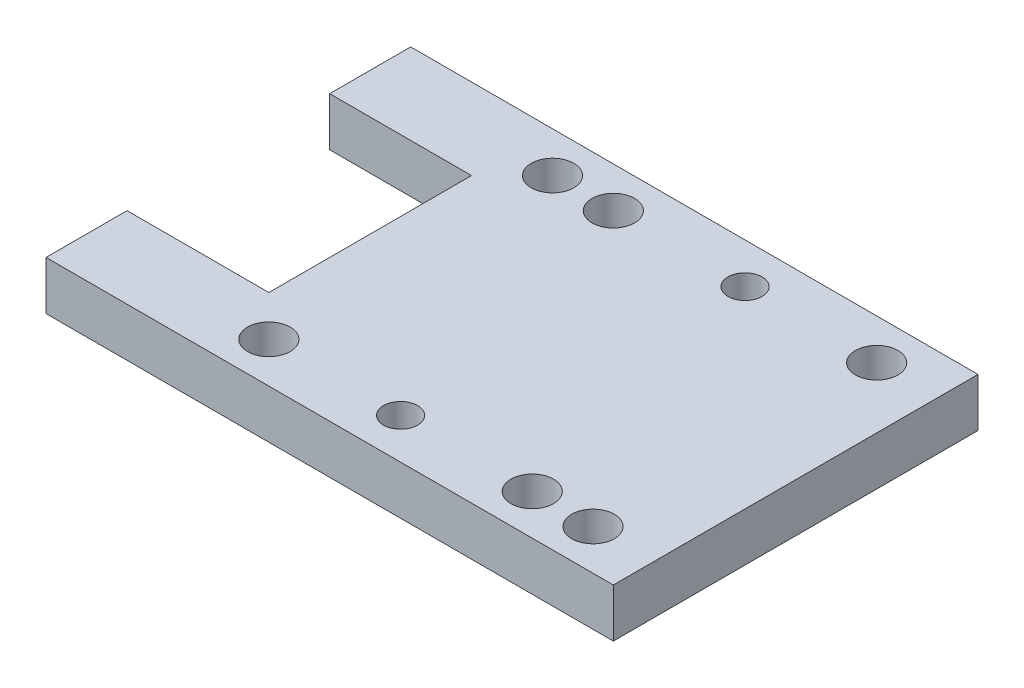
ISO-10303-21;
HEADER;
FILE_DESCRIPTION(('STEP AP214'),'2;1');
FILE_NAME('part.step','',(''),(''),'','','');
FILE_SCHEMA(('AUTOMOTIVE_DESIGN { 1 0 10303 214 1 1 1 1 }'));
ENDSEC;
DATA;
#1=APPLICATION_CONTEXT('core data for automotive mechanical design processes');
#2=APPLICATION_PROTOCOL_DEFINITION('international standard','automotive_design',2000,#1);
#3=PRODUCT_CONTEXT('',#1,'mechanical');
#4=PRODUCT('Part','Part','',(#3));
#5=PRODUCT_RELATED_PRODUCT_CATEGORY('part','',(#4));
#6=PRODUCT_DEFINITION_FORMATION('','',#4);
#7=PRODUCT_DEFINITION_CONTEXT('part definition',#1,'design');
#8=PRODUCT_DEFINITION('design','',#6,#7);
#9=PRODUCT_DEFINITION_SHAPE('','',#8);
#10=(LENGTH_UNIT() NAMED_UNIT(*) SI_UNIT(.MILLI.,.METRE.));
#11=(NAMED_UNIT(*) PLANE_ANGLE_UNIT() SI_UNIT($,.RADIAN.));
#12=(NAMED_UNIT(*) SI_UNIT($,.STERADIAN.) SOLID_ANGLE_UNIT());
#13=UNCERTAINTY_MEASURE_WITH_UNIT(LENGTH_MEASURE(1.E-05),#10,'distance_accuracy_value','');
#14=(GEOMETRIC_REPRESENTATION_CONTEXT(3) GLOBAL_UNCERTAINTY_ASSIGNED_CONTEXT((#13)) GLOBAL_UNIT_ASSIGNED_CONTEXT((#10,
#11,#12)) REPRESENTATION_CONTEXT('',''));
#15=CARTESIAN_POINT('',(0.,0.,0.));
#16=DIRECTION('',(0.,0.,1.));
#17=DIRECTION('',(1.,0.,0.));
#18=AXIS2_PLACEMENT_3D('',#15,#16,#17);
#19=CARTESIAN_POINT('',(-70.,-12.,45.));
#20=DIRECTION('',(-1.,0.,0.));
#21=DIRECTION('',(0.,0.,1.));
#22=AXIS2_PLACEMENT_3D('',#19,#20,#21);
#23=PLANE('',#22);
#24=CARTESIAN_POINT('',(-70.,-6.,-35.));
#25=DIRECTION('',(-1.,0.,0.));
#26=DIRECTION('',(0.,0.,1.));
#27=AXIS2_PLACEMENT_3D('',#24,#25,#26);
#28=CIRCLE('',#27,3.39999999999999);
#29=CARTESIAN_POINT('',(-70.,-6.,-31.6));
#30=VERTEX_POINT('',#29);
#31=EDGE_CURVE('E138',#30,#30,#28,.T.);
#32=ORIENTED_EDGE('',*,*,#31,.F.);
#33=EDGE_LOOP('',(#32));
#34=FACE_BOUND('',#33,.T.);
#35=DIRECTION('',(0.,1.,0.));
#36=VECTOR('',#35,1.);
#37=CARTESIAN_POINT('',(-70.,-12.001,-25.));
#38=LINE('',#37,#36);
#39=CARTESIAN_POINT('',(-70.,-12.,-25.));
#40=VERTEX_POINT('',#39);
#41=CARTESIAN_POINT('',(-70.,0.,-25.));
#42=VERTEX_POINT('',#41);
#43=EDGE_CURVE('E200',#40,#42,#38,.T.);
#44=ORIENTED_EDGE('',*,*,#43,.T.);
#45=DIRECTION('',(0.,0.,1.));
#46=VECTOR('',#45,1.);
#47=CARTESIAN_POINT('',(-70.,0.,45.));
#48=LINE('',#47,#46);
#49=CARTESIAN_POINT('',(-70.,0.,-45.));
#50=VERTEX_POINT('',#49);
#51=EDGE_CURVE('E229',#50,#42,#48,.T.);
#52=ORIENTED_EDGE('',*,*,#51,.F.);
#53=DIRECTION('',(0.,1.,0.));
#54=VECTOR('',#53,1.);
#55=CARTESIAN_POINT('',(-70.,-12.,-45.));
#56=LINE('',#55,#54);
#57=CARTESIAN_POINT('',(-70.,-12.,-45.));
#58=VERTEX_POINT('',#57);
#59=EDGE_CURVE('E235',#58,#50,#56,.T.);
#60=ORIENTED_EDGE('',*,*,#59,.F.);
#61=DIRECTION('',(0.,0.,1.));
#62=VECTOR('',#61,1.);
#63=CARTESIAN_POINT('',(-70.,-12.,45.));
#64=LINE('',#63,#62);
#65=EDGE_CURVE('E218',#58,#40,#64,.T.);
#66=ORIENTED_EDGE('',*,*,#65,.T.);
#67=EDGE_LOOP('',(#44,#52,#60,#66));
#68=FACE_BOUND('',#67,.T.);
#69=ADVANCED_FACE('F50',(#34,#68),#23,.T.);
#70=CARTESIAN_POINT('',(70.,-12.,45.));
#71=DIRECTION('',(1.,0.,0.));
#72=DIRECTION('',(0.,0.,-1.));
#73=AXIS2_PLACEMENT_3D('',#70,#71,#72);
#74=PLANE('',#73);
#75=DIRECTION('',(0.,0.,-1.));
#76=VECTOR('',#75,1.);
#77=CARTESIAN_POINT('',(70.,0.,45.));
#78=LINE('',#77,#76);
#79=CARTESIAN_POINT('',(70.,0.,45.));
#80=VERTEX_POINT('',#79);
#81=CARTESIAN_POINT('',(70.,0.,-45.));
#82=VERTEX_POINT('',#81);
#83=EDGE_CURVE('E211',#80,#82,#78,.T.);
#84=ORIENTED_EDGE('',*,*,#83,.F.);
#85=DIRECTION('',(0.,1.,0.));
#86=VECTOR('',#85,1.);
#87=CARTESIAN_POINT('',(70.,-12.,45.));
#88=LINE('',#87,#86);
#89=CARTESIAN_POINT('',(70.,-12.,45.));
#90=VERTEX_POINT('',#89);
#91=EDGE_CURVE('E11',#90,#80,#88,.T.);
#92=ORIENTED_EDGE('',*,*,#91,.F.);
#93=DIRECTION('',(0.,0.,-1.));
#94=VECTOR('',#93,1.);
#95=CARTESIAN_POINT('',(70.,-12.,45.));
#96=LINE('',#95,#94);
#97=CARTESIAN_POINT('',(70.,-12.,-45.));
#98=VERTEX_POINT('',#97);
#99=EDGE_CURVE('E212',#90,#98,#96,.T.);
#100=ORIENTED_EDGE('',*,*,#99,.T.);
#101=DIRECTION('',(0.,1.,0.));
#102=VECTOR('',#101,1.);
#103=CARTESIAN_POINT('',(70.,-12.,-45.));
#104=LINE('',#103,#102);
#105=EDGE_CURVE('E54',#98,#82,#104,.T.);
#106=ORIENTED_EDGE('',*,*,#105,.T.);
#107=EDGE_LOOP('',(#84,#92,#100,#106));
#108=FACE_BOUND('',#107,.T.);
#109=ADVANCED_FACE('F52',(#108),#74,.T.);
#110=CARTESIAN_POINT('',(-70.,-12.,45.));
#111=DIRECTION('',(0.,0.,1.));
#112=DIRECTION('',(1.,0.,0.));
#113=AXIS2_PLACEMENT_3D('',#110,#111,#112);
#114=PLANE('',#113);
#115=DIRECTION('',(1.,0.,0.));
#116=VECTOR('',#115,1.);
#117=CARTESIAN_POINT('',(-70.,0.,45.));
#118=LINE('',#117,#116);
#119=CARTESIAN_POINT('',(-70.,0.,45.));
#120=VERTEX_POINT('',#119);
#121=EDGE_CURVE('E215',#120,#80,#118,.T.);
#122=ORIENTED_EDGE('',*,*,#121,.F.);
#123=DIRECTION('',(0.,1.,0.));
#124=VECTOR('',#123,1.);
#125=CARTESIAN_POINT('',(-70.,-12.,45.));
#126=LINE('',#125,#124);
#127=CARTESIAN_POINT('',(-70.,-12.,45.));
#128=VERTEX_POINT('',#127);
#129=EDGE_CURVE('E59',#128,#120,#126,.T.);
#130=ORIENTED_EDGE('',*,*,#129,.F.);
#131=DIRECTION('',(1.,0.,0.));
#132=VECTOR('',#131,1.);
#133=CARTESIAN_POINT('',(-70.,-12.,45.));
#134=LINE('',#133,#132);
#135=EDGE_CURVE('E221',#128,#90,#134,.T.);
#136=ORIENTED_EDGE('',*,*,#135,.T.);
#137=ORIENTED_EDGE('',*,*,#91,.T.);
#138=EDGE_LOOP('',(#122,#130,#136,#137));
#139=FACE_BOUND('',#138,.T.);
#140=ADVANCED_FACE('F242',(#139),#114,.T.);
#141=CARTESIAN_POINT('',(-70.,-6.,35.));
#142=DIRECTION('',(-1.,0.,0.));
#143=DIRECTION('',(0.,0.,1.));
#144=AXIS2_PLACEMENT_3D('',#141,#142,#143);
#145=CIRCLE('',#144,3.39999999999999);
#146=CARTESIAN_POINT('',(-70.,-6.,38.4));
#147=VERTEX_POINT('',#146);
#148=EDGE_CURVE('E139',#147,#147,#145,.T.);
#149=ORIENTED_EDGE('',*,*,#148,.F.);
#150=EDGE_LOOP('',(#149));
#151=FACE_BOUND('',#150,.T.);
#152=DIRECTION('',(0.,1.,0.));
#153=VECTOR('',#152,1.);
#154=CARTESIAN_POINT('',(-70.,-12.001,25.));
#155=LINE('',#154,#153);
#156=CARTESIAN_POINT('',(-70.,-12.,25.));
#157=VERTEX_POINT('',#156);
#158=CARTESIAN_POINT('',(-70.,0.,25.));
#159=VERTEX_POINT('',#158);
#160=EDGE_CURVE('E67',#157,#159,#155,.T.);
#161=ORIENTED_EDGE('',*,*,#160,.F.);
#162=EDGE_CURVE('E217',#157,#128,#64,.T.);
#163=ORIENTED_EDGE('',*,*,#162,.T.);
#164=ORIENTED_EDGE('',*,*,#129,.T.);
#165=EDGE_CURVE('E228',#159,#120,#48,.T.);
#166=ORIENTED_EDGE('',*,*,#165,.F.);
#167=EDGE_LOOP('',(#161,#163,#164,#166));
#168=FACE_BOUND('',#167,.T.);
#169=ADVANCED_FACE('F259',(#151,#168),#23,.T.);
#170=CARTESIAN_POINT('',(-70.,-12.,-45.));
#171=DIRECTION('',(0.,0.,-1.));
#172=DIRECTION('',(-1.,0.,0.));
#173=AXIS2_PLACEMENT_3D('',#170,#171,#172);
#174=PLANE('',#173);
#175=DIRECTION('',(-1.,0.,0.));
#176=VECTOR('',#175,1.);
#177=CARTESIAN_POINT('',(-70.,0.,-45.));
#178=LINE('',#177,#176);
#179=EDGE_CURVE('E225',#82,#50,#178,.T.);
#180=ORIENTED_EDGE('',*,*,#179,.F.);
#181=ORIENTED_EDGE('',*,*,#105,.F.);
#182=DIRECTION('',(-1.,0.,0.));
#183=VECTOR('',#182,1.);
#184=CARTESIAN_POINT('',(-70.,-12.,-45.));
#185=LINE('',#184,#183);
#186=EDGE_CURVE('E214',#98,#58,#185,.T.);
#187=ORIENTED_EDGE('',*,*,#186,.T.);
#188=ORIENTED_EDGE('',*,*,#59,.T.);
#189=EDGE_LOOP('',(#180,#181,#187,#188));
#190=FACE_BOUND('',#189,.T.);
#191=ADVANCED_FACE('F237',(#190),#174,.T.);
#192=CARTESIAN_POINT('',(0.,-12.,0.));
#193=DIRECTION('',(0.,-1.,0.));
#194=DIRECTION('',(0.,0.,-1.));
#195=AXIS2_PLACEMENT_3D('',#192,#193,#194);
#196=PLANE('',#195);
#197=CARTESIAN_POINT('',(22.5,-12.,-35.));
#198=DIRECTION('',(0.,1.,0.));
#199=DIRECTION('',(0.,0.,1.));
#200=AXIS2_PLACEMENT_3D('',#197,#198,#199);
#201=CIRCLE('',#200,4.19999999999999);
#202=CARTESIAN_POINT('',(22.5,-12.,-30.8));
#203=VERTEX_POINT('',#202);
#204=EDGE_CURVE('E356',#203,#203,#201,.T.);
#205=ORIENTED_EDGE('',*,*,#204,.T.);
#206=EDGE_LOOP('',(#205));
#207=FACE_BOUND('',#206,.T.);
#208=CARTESIAN_POINT('',(7.50000000000001,-12.,35.));
#209=DIRECTION('',(0.,1.,0.));
#210=DIRECTION('',(0.,0.,1.));
#211=AXIS2_PLACEMENT_3D('',#208,#209,#210);
#212=CIRCLE('',#211,4.19999999999999);
#213=CARTESIAN_POINT('',(7.50000000000001,-12.,39.2));
#214=VERTEX_POINT('',#213);
#215=EDGE_CURVE('E145',#214,#214,#212,.T.);
#216=ORIENTED_EDGE('',*,*,#215,.T.);
#217=EDGE_LOOP('',(#216));
#218=FACE_BOUND('',#217,.T.);
#219=CARTESIAN_POINT('',(-25.,-12.,-35.));
#220=DIRECTION('',(0.,1.,0.));
#221=DIRECTION('',(0.,0.,1.));
#222=AXIS2_PLACEMENT_3D('',#219,#220,#221);
#223=CIRCLE('',#222,5.25);
#224=CARTESIAN_POINT('',(-25.,-12.,-29.75));
#225=VERTEX_POINT('',#224);
#226=EDGE_CURVE('E154',#225,#225,#223,.T.);
#227=ORIENTED_EDGE('',*,*,#226,.T.);
#228=EDGE_LOOP('',(#227));
#229=FACE_BOUND('',#228,.T.);
#230=CARTESIAN_POINT('',(55.,-12.,35.));
#231=DIRECTION('',(0.,1.,0.));
#232=DIRECTION('',(0.,0.,1.));
#233=AXIS2_PLACEMENT_3D('',#230,#231,#232);
#234=CIRCLE('',#233,5.25);
#235=CARTESIAN_POINT('',(55.,-12.,40.25));
#236=VERTEX_POINT('',#235);
#237=EDGE_CURVE('E160',#236,#236,#234,.T.);
#238=ORIENTED_EDGE('',*,*,#237,.T.);
#239=EDGE_LOOP('',(#238));
#240=FACE_BOUND('',#239,.T.);
#241=CARTESIAN_POINT('',(-9.99999999999999,-12.,-35.));
#242=DIRECTION('',(0.,1.,0.));
#243=DIRECTION('',(0.,0.,1.));
#244=AXIS2_PLACEMENT_3D('',#241,#242,#243);
#245=CIRCLE('',#244,5.25);
#246=CARTESIAN_POINT('',(-9.99999999999999,-12.,-29.75));
#247=VERTEX_POINT('',#246);
#248=EDGE_CURVE('E166',#247,#247,#245,.T.);
#249=ORIENTED_EDGE('',*,*,#248,.T.);
#250=EDGE_LOOP('',(#249));
#251=FACE_BOUND('',#250,.T.);
#252=CARTESIAN_POINT('',(55.,-12.,-35.));
#253=DIRECTION('',(0.,1.,0.));
#254=DIRECTION('',(0.,0.,1.));
#255=AXIS2_PLACEMENT_3D('',#252,#253,#254);
#256=CIRCLE('',#255,5.25);
#257=CARTESIAN_POINT('',(55.,-12.,-29.75));
#258=VERTEX_POINT('',#257);
#259=EDGE_CURVE('E172',#258,#258,#256,.T.);
#260=ORIENTED_EDGE('',*,*,#259,.T.);
#261=EDGE_LOOP('',(#260));
#262=FACE_BOUND('',#261,.T.);
#263=CARTESIAN_POINT('',(40.,-12.,35.));
#264=DIRECTION('',(0.,1.,0.));
#265=DIRECTION('',(0.,0.,1.));
#266=AXIS2_PLACEMENT_3D('',#263,#264,#265);
#267=CIRCLE('',#266,5.25);
#268=CARTESIAN_POINT('',(40.,-12.,40.25));
#269=VERTEX_POINT('',#268);
#270=EDGE_CURVE('E178',#269,#269,#267,.T.);
#271=ORIENTED_EDGE('',*,*,#270,.T.);
#272=EDGE_LOOP('',(#271));
#273=FACE_BOUND('',#272,.T.);
#274=CARTESIAN_POINT('',(-25.,-12.,35.));
#275=DIRECTION('',(0.,1.,0.));
#276=DIRECTION('',(0.,0.,1.));
#277=AXIS2_PLACEMENT_3D('',#274,#275,#276);
#278=CIRCLE('',#277,5.24999999999999);
#279=CARTESIAN_POINT('',(-25.,-12.,40.25));
#280=VERTEX_POINT('',#279);
#281=EDGE_CURVE('E184',#280,#280,#278,.T.);
#282=ORIENTED_EDGE('',*,*,#281,.T.);
#283=EDGE_LOOP('',(#282));
#284=FACE_BOUND('',#283,.T.);
#285=DIRECTION('',(-1.,0.,0.));
#286=VECTOR('',#285,1.);
#287=CARTESIAN_POINT('',(-70.,-12.,-25.));
#288=LINE('',#287,#286);
#289=CARTESIAN_POINT('',(-35.,-12.,-25.));
#290=VERTEX_POINT('',#289);
#291=EDGE_CURVE('E190',#290,#40,#288,.T.);
#292=ORIENTED_EDGE('',*,*,#291,.T.);
#293=ORIENTED_EDGE('',*,*,#65,.F.);
#294=ORIENTED_EDGE('',*,*,#186,.F.);
#295=ORIENTED_EDGE('',*,*,#99,.F.);
#296=ORIENTED_EDGE('',*,*,#135,.F.);
#297=ORIENTED_EDGE('',*,*,#162,.F.);
#298=DIRECTION('',(1.,0.,0.));
#299=VECTOR('',#298,1.);
#300=CARTESIAN_POINT('',(-70.,-12.,25.));
#301=LINE('',#300,#299);
#302=CARTESIAN_POINT('',(-35.,-12.,25.));
#303=VERTEX_POINT('',#302);
#304=EDGE_CURVE('E203',#157,#303,#301,.T.);
#305=ORIENTED_EDGE('',*,*,#304,.T.);
#306=DIRECTION('',(0.,0.,-1.));
#307=VECTOR('',#306,1.);
#308=CARTESIAN_POINT('',(-35.,-12.,25.));
#309=LINE('',#308,#307);
#310=EDGE_CURVE('E187',#303,#290,#309,.T.);
#311=ORIENTED_EDGE('',*,*,#310,.T.);
#312=EDGE_LOOP('',(#292,#293,#294,#295,#296,#297,#305,#311));
#313=FACE_BOUND('',#312,.T.);
#314=ADVANCED_FACE('F247',(#207,#218,#229,#240,#251,#262,#273,#284,#313),#196,.T.);
#315=CARTESIAN_POINT('',(0.,0.,0.));
#316=DIRECTION('',(0.,-1.,0.));
#317=DIRECTION('',(0.,0.,-1.));
#318=AXIS2_PLACEMENT_3D('',#315,#316,#317);
#319=PLANE('',#318);
#320=CARTESIAN_POINT('',(22.5,0.,-35.));
#321=DIRECTION('',(0.,1.,0.));
#322=DIRECTION('',(0.,0.,1.));
#323=AXIS2_PLACEMENT_3D('',#320,#321,#322);
#324=CIRCLE('',#323,4.19999999999999);
#325=CARTESIAN_POINT('',(22.5,0.,-30.8));
#326=VERTEX_POINT('',#325);
#327=EDGE_CURVE('E333',#326,#326,#324,.T.);
#328=ORIENTED_EDGE('',*,*,#327,.F.);
#329=EDGE_LOOP('',(#328));
#330=FACE_BOUND('',#329,.T.);
#331=CARTESIAN_POINT('',(7.50000000000001,0.,35.));
#332=DIRECTION('',(0.,1.,0.));
#333=DIRECTION('',(0.,0.,1.));
#334=AXIS2_PLACEMENT_3D('',#331,#332,#333);
#335=CIRCLE('',#334,4.19999999999999);
#336=CARTESIAN_POINT('',(7.50000000000001,0.,39.2));
#337=VERTEX_POINT('',#336);
#338=EDGE_CURVE('E337',#337,#337,#335,.T.);
#339=ORIENTED_EDGE('',*,*,#338,.F.);
#340=EDGE_LOOP('',(#339));
#341=FACE_BOUND('',#340,.T.);
#342=CARTESIAN_POINT('',(-25.,0.,-35.));
#343=DIRECTION('',(0.,1.,0.));
#344=DIRECTION('',(0.,0.,1.));
#345=AXIS2_PLACEMENT_3D('',#342,#343,#344);
#346=CIRCLE('',#345,5.25);
#347=CARTESIAN_POINT('',(-25.,0.,-29.75));
#348=VERTEX_POINT('',#347);
#349=EDGE_CURVE('E151',#348,#348,#346,.T.);
#350=ORIENTED_EDGE('',*,*,#349,.F.);
#351=EDGE_LOOP('',(#350));
#352=FACE_BOUND('',#351,.T.);
#353=CARTESIAN_POINT('',(55.,0.,35.));
#354=DIRECTION('',(0.,1.,0.));
#355=DIRECTION('',(0.,0.,1.));
#356=AXIS2_PLACEMENT_3D('',#353,#354,#355);
#357=CIRCLE('',#356,5.25);
#358=CARTESIAN_POINT('',(55.,0.,40.25));
#359=VERTEX_POINT('',#358);
#360=EDGE_CURVE('E157',#359,#359,#357,.T.);
#361=ORIENTED_EDGE('',*,*,#360,.F.);
#362=EDGE_LOOP('',(#361));
#363=FACE_BOUND('',#362,.T.);
#364=CARTESIAN_POINT('',(-9.99999999999999,0.,-35.));
#365=DIRECTION('',(0.,1.,0.));
#366=DIRECTION('',(0.,0.,1.));
#367=AXIS2_PLACEMENT_3D('',#364,#365,#366);
#368=CIRCLE('',#367,5.24999999999999);
#369=CARTESIAN_POINT('',(-9.99999999999999,0.,-29.75));
#370=VERTEX_POINT('',#369);
#371=EDGE_CURVE('E163',#370,#370,#368,.T.);
#372=ORIENTED_EDGE('',*,*,#371,.F.);
#373=EDGE_LOOP('',(#372));
#374=FACE_BOUND('',#373,.T.);
#375=CARTESIAN_POINT('',(55.,0.,-35.));
#376=DIRECTION('',(0.,1.,0.));
#377=DIRECTION('',(0.,0.,1.));
#378=AXIS2_PLACEMENT_3D('',#375,#376,#377);
#379=CIRCLE('',#378,5.24999999999999);
#380=CARTESIAN_POINT('',(55.,0.,-29.75));
#381=VERTEX_POINT('',#380);
#382=EDGE_CURVE('E169',#381,#381,#379,.T.);
#383=ORIENTED_EDGE('',*,*,#382,.F.);
#384=EDGE_LOOP('',(#383));
#385=FACE_BOUND('',#384,.T.);
#386=CARTESIAN_POINT('',(40.,0.,35.));
#387=DIRECTION('',(0.,1.,0.));
#388=DIRECTION('',(0.,0.,1.));
#389=AXIS2_PLACEMENT_3D('',#386,#387,#388);
#390=CIRCLE('',#389,5.24999999999999);
#391=CARTESIAN_POINT('',(40.,0.,40.25));
#392=VERTEX_POINT('',#391);
#393=EDGE_CURVE('E175',#392,#392,#390,.T.);
#394=ORIENTED_EDGE('',*,*,#393,.F.);
#395=EDGE_LOOP('',(#394));
#396=FACE_BOUND('',#395,.T.);
#397=CARTESIAN_POINT('',(-25.,0.,35.));
#398=DIRECTION('',(0.,1.,0.));
#399=DIRECTION('',(0.,0.,1.));
#400=AXIS2_PLACEMENT_3D('',#397,#398,#399);
#401=CIRCLE('',#400,5.24999999999999);
#402=CARTESIAN_POINT('',(-25.,0.,40.25));
#403=VERTEX_POINT('',#402);
#404=EDGE_CURVE('E181',#403,#403,#401,.T.);
#405=ORIENTED_EDGE('',*,*,#404,.F.);
#406=EDGE_LOOP('',(#405));
#407=FACE_BOUND('',#406,.T.);
#408=ORIENTED_EDGE('',*,*,#51,.T.);
#409=DIRECTION('',(-1.,0.,0.));
#410=VECTOR('',#409,1.);
#411=CARTESIAN_POINT('',(-70.,0.,-25.));
#412=LINE('',#411,#410);
#413=CARTESIAN_POINT('',(-35.,0.,-25.));
#414=VERTEX_POINT('',#413);
#415=EDGE_CURVE('E198',#414,#42,#412,.T.);
#416=ORIENTED_EDGE('',*,*,#415,.F.);
#417=DIRECTION('',(0.,0.,-1.));
#418=VECTOR('',#417,1.);
#419=CARTESIAN_POINT('',(-35.,0.,25.));
#420=LINE('',#419,#418);
#421=CARTESIAN_POINT('',(-35.,0.,25.));
#422=VERTEX_POINT('',#421);
#423=EDGE_CURVE('E195',#422,#414,#420,.T.);
#424=ORIENTED_EDGE('',*,*,#423,.F.);
#425=DIRECTION('',(1.,0.,0.));
#426=VECTOR('',#425,1.);
#427=CARTESIAN_POINT('',(-70.,0.,25.));
#428=LINE('',#427,#426);
#429=EDGE_CURVE('E193',#159,#422,#428,.T.);
#430=ORIENTED_EDGE('',*,*,#429,.F.);
#431=ORIENTED_EDGE('',*,*,#165,.T.);
#432=ORIENTED_EDGE('',*,*,#121,.T.);
#433=ORIENTED_EDGE('',*,*,#83,.T.);
#434=ORIENTED_EDGE('',*,*,#179,.T.);
#435=EDGE_LOOP('',(#408,#416,#424,#430,#431,#432,#433,#434));
#436=FACE_BOUND('',#435,.T.);
#437=ADVANCED_FACE('F239',(#330,#341,#352,#363,#374,#385,#396,#407,#436),#319,.F.);
#438=CARTESIAN_POINT('',(-70.,-12.001,-25.));
#439=DIRECTION('',(0.,0.,-1.));
#440=DIRECTION('',(-1.,0.,0.));
#441=AXIS2_PLACEMENT_3D('',#438,#439,#440);
#442=PLANE('',#441);
#443=DIRECTION('',(0.,1.,0.));
#444=VECTOR('',#443,1.);
#445=CARTESIAN_POINT('',(-35.,-12.001,-25.));
#446=LINE('',#445,#444);
#447=EDGE_CURVE('E204',#290,#414,#446,.T.);
#448=ORIENTED_EDGE('',*,*,#447,.T.);
#449=ORIENTED_EDGE('',*,*,#415,.T.);
#450=ORIENTED_EDGE('',*,*,#43,.F.);
#451=ORIENTED_EDGE('',*,*,#291,.F.);
#452=EDGE_LOOP('',(#448,#449,#450,#451));
#453=FACE_BOUND('',#452,.T.);
#454=ADVANCED_FACE('F253',(#453),#442,.F.);
#455=CARTESIAN_POINT('',(-35.,-12.001,25.));
#456=DIRECTION('',(1.,0.,0.));
#457=DIRECTION('',(0.,0.,-1.));
#458=AXIS2_PLACEMENT_3D('',#455,#456,#457);
#459=PLANE('',#458);
#460=DIRECTION('',(0.,1.,0.));
#461=VECTOR('',#460,1.);
#462=CARTESIAN_POINT('',(-35.,-12.001,25.));
#463=LINE('',#462,#461);
#464=EDGE_CURVE('E206',#303,#422,#463,.T.);
#465=ORIENTED_EDGE('',*,*,#464,.T.);
#466=ORIENTED_EDGE('',*,*,#423,.T.);
#467=ORIENTED_EDGE('',*,*,#447,.F.);
#468=ORIENTED_EDGE('',*,*,#310,.F.);
#469=EDGE_LOOP('',(#465,#466,#467,#468));
#470=FACE_BOUND('',#469,.T.);
#471=ADVANCED_FACE('F256',(#470),#459,.F.);
#472=CARTESIAN_POINT('',(-70.,-12.001,25.));
#473=DIRECTION('',(0.,0.,1.));
#474=DIRECTION('',(1.,0.,0.));
#475=AXIS2_PLACEMENT_3D('',#472,#473,#474);
#476=PLANE('',#475);
#477=ORIENTED_EDGE('',*,*,#160,.T.);
#478=ORIENTED_EDGE('',*,*,#429,.T.);
#479=ORIENTED_EDGE('',*,*,#464,.F.);
#480=ORIENTED_EDGE('',*,*,#304,.F.);
#481=EDGE_LOOP('',(#477,#478,#479,#480));
#482=FACE_BOUND('',#481,.T.);
#483=ADVANCED_FACE('F258',(#482),#476,.F.);
#484=CARTESIAN_POINT('',(-25.,0.,35.));
#485=DIRECTION('',(0.,1.,0.));
#486=DIRECTION('',(0.,0.,1.));
#487=AXIS2_PLACEMENT_3D('',#484,#485,#486);
#488=CYLINDRICAL_SURFACE('',#487,5.24999999999999);
#489=ORIENTED_EDGE('',*,*,#281,.F.);
#490=EDGE_LOOP('',(#489));
#491=FACE_BOUND('',#490,.T.);
#492=ORIENTED_EDGE('',*,*,#404,.T.);
#493=EDGE_LOOP('',(#492));
#494=FACE_BOUND('',#493,.T.);
#495=ADVANCED_FACE('F311',(#491,#494),#488,.F.);
#496=CARTESIAN_POINT('',(40.,0.,35.));
#497=DIRECTION('',(0.,1.,0.));
#498=DIRECTION('',(0.,0.,1.));
#499=AXIS2_PLACEMENT_3D('',#496,#497,#498);
#500=CYLINDRICAL_SURFACE('',#499,5.24999999999999);
#501=ORIENTED_EDGE('',*,*,#270,.F.);
#502=EDGE_LOOP('',(#501));
#503=FACE_BOUND('',#502,.T.);
#504=ORIENTED_EDGE('',*,*,#393,.T.);
#505=EDGE_LOOP('',(#504));
#506=FACE_BOUND('',#505,.T.);
#507=ADVANCED_FACE('F307',(#503,#506),#500,.F.);
#508=CARTESIAN_POINT('',(55.,0.,-35.));
#509=DIRECTION('',(0.,1.,0.));
#510=DIRECTION('',(0.,0.,1.));
#511=AXIS2_PLACEMENT_3D('',#508,#509,#510);
#512=CYLINDRICAL_SURFACE('',#511,5.24999999999999);
#513=ORIENTED_EDGE('',*,*,#259,.F.);
#514=EDGE_LOOP('',(#513));
#515=FACE_BOUND('',#514,.T.);
#516=ORIENTED_EDGE('',*,*,#382,.T.);
#517=EDGE_LOOP('',(#516));
#518=FACE_BOUND('',#517,.T.);
#519=ADVANCED_FACE('F303',(#515,#518),#512,.F.);
#520=CARTESIAN_POINT('',(-9.99999999999999,0.,-35.));
#521=DIRECTION('',(0.,1.,0.));
#522=DIRECTION('',(0.,0.,1.));
#523=AXIS2_PLACEMENT_3D('',#520,#521,#522);
#524=CYLINDRICAL_SURFACE('',#523,5.24999999999999);
#525=ORIENTED_EDGE('',*,*,#248,.F.);
#526=EDGE_LOOP('',(#525));
#527=FACE_BOUND('',#526,.T.);
#528=ORIENTED_EDGE('',*,*,#371,.T.);
#529=EDGE_LOOP('',(#528));
#530=FACE_BOUND('',#529,.T.);
#531=ADVANCED_FACE('F299',(#527,#530),#524,.F.);
#532=CARTESIAN_POINT('',(55.,0.,35.));
#533=DIRECTION('',(0.,1.,0.));
#534=DIRECTION('',(0.,0.,1.));
#535=AXIS2_PLACEMENT_3D('',#532,#533,#534);
#536=CYLINDRICAL_SURFACE('',#535,5.25);
#537=ORIENTED_EDGE('',*,*,#237,.F.);
#538=EDGE_LOOP('',(#537));
#539=FACE_BOUND('',#538,.T.);
#540=ORIENTED_EDGE('',*,*,#360,.T.);
#541=EDGE_LOOP('',(#540));
#542=FACE_BOUND('',#541,.T.);
#543=ADVANCED_FACE('F295',(#539,#542),#536,.F.);
#544=CARTESIAN_POINT('',(-25.,0.,-35.));
#545=DIRECTION('',(0.,1.,0.));
#546=DIRECTION('',(0.,0.,1.));
#547=AXIS2_PLACEMENT_3D('',#544,#545,#546);
#548=CYLINDRICAL_SURFACE('',#547,5.25);
#549=ORIENTED_EDGE('',*,*,#226,.F.);
#550=EDGE_LOOP('',(#549));
#551=FACE_BOUND('',#550,.T.);
#552=ORIENTED_EDGE('',*,*,#349,.T.);
#553=EDGE_LOOP('',(#552));
#554=FACE_BOUND('',#553,.T.);
#555=ADVANCED_FACE('F287',(#551,#554),#548,.F.);
#556=CARTESIAN_POINT('',(-49.7929261046937,-6.,-35.));
#557=DIRECTION('',(-1.,0.,0.));
#558=DIRECTION('',(0.,0.,1.));
#559=AXIS2_PLACEMENT_3D('',#556,#557,#558);
#560=CONICAL_SURFACE('',#559,3.4,1.02974425867665);
#561=CARTESIAN_POINT('',(-47.75,-6.00000000000001,-35.));
#562=VERTEX_POINT('',#561);
#563=VERTEX_LOOP('',#562);
#564=FACE_BOUND('',#563,.T.);
#565=CARTESIAN_POINT('',(-49.7929261046937,-6.,-35.));
#566=DIRECTION('',(-1.,0.,0.));
#567=DIRECTION('',(0.,0.,1.));
#568=AXIS2_PLACEMENT_3D('',#565,#566,#567);
#569=CIRCLE('',#568,3.4);
#570=CARTESIAN_POINT('',(-49.7929261046937,-6.,-31.6));
#571=VERTEX_POINT('',#570);
#572=EDGE_CURVE('E142',#571,#571,#569,.T.);
#573=ORIENTED_EDGE('',*,*,#572,.T.);
#574=EDGE_LOOP('',(#573));
#575=FACE_BOUND('',#574,.T.);
#576=ADVANCED_FACE('F280',(#564,#575),#560,.F.);
#577=CARTESIAN_POINT('',(-70.,-6.,-35.));
#578=DIRECTION('',(-1.,0.,0.));
#579=DIRECTION('',(0.,0.,1.));
#580=AXIS2_PLACEMENT_3D('',#577,#578,#579);
#581=CYLINDRICAL_SURFACE('',#580,3.39999999999999);
#582=ORIENTED_EDGE('',*,*,#572,.F.);
#583=EDGE_LOOP('',(#582));
#584=FACE_BOUND('',#583,.T.);
#585=ORIENTED_EDGE('',*,*,#31,.T.);
#586=EDGE_LOOP('',(#585));
#587=FACE_BOUND('',#586,.T.);
#588=ADVANCED_FACE('F132',(#584,#587),#581,.F.);
#589=CARTESIAN_POINT('',(-49.7929261046937,-6.,35.));
#590=DIRECTION('',(-1.,0.,0.));
#591=DIRECTION('',(0.,0.,1.));
#592=AXIS2_PLACEMENT_3D('',#589,#590,#591);
#593=CONICAL_SURFACE('',#592,3.4,1.02974425867665);
#594=CARTESIAN_POINT('',(-47.75,-6.00000000000001,35.));
#595=VERTEX_POINT('',#594);
#596=VERTEX_LOOP('',#595);
#597=FACE_BOUND('',#596,.T.);
#598=CARTESIAN_POINT('',(-49.7929261046937,-6.,35.));
#599=DIRECTION('',(-1.,0.,0.));
#600=DIRECTION('',(0.,0.,1.));
#601=AXIS2_PLACEMENT_3D('',#598,#599,#600);
#602=CIRCLE('',#601,3.4);
#603=CARTESIAN_POINT('',(-49.7929261046937,-6.,38.4));
#604=VERTEX_POINT('',#603);
#605=EDGE_CURVE('E136',#604,#604,#602,.T.);
#606=ORIENTED_EDGE('',*,*,#605,.T.);
#607=EDGE_LOOP('',(#606));
#608=FACE_BOUND('',#607,.T.);
#609=ADVANCED_FACE('F128',(#597,#608),#593,.F.);
#610=CARTESIAN_POINT('',(-70.,-6.,35.));
#611=DIRECTION('',(-1.,0.,0.));
#612=DIRECTION('',(0.,0.,1.));
#613=AXIS2_PLACEMENT_3D('',#610,#611,#612);
#614=CYLINDRICAL_SURFACE('',#613,3.39999999999999);
#615=ORIENTED_EDGE('',*,*,#605,.F.);
#616=EDGE_LOOP('',(#615));
#617=FACE_BOUND('',#616,.T.);
#618=ORIENTED_EDGE('',*,*,#148,.T.);
#619=EDGE_LOOP('',(#618));
#620=FACE_BOUND('',#619,.T.);
#621=ADVANCED_FACE('F131',(#617,#620),#614,.F.);
#622=CARTESIAN_POINT('',(7.50000000000001,0.,35.));
#623=DIRECTION('',(0.,1.,0.));
#624=DIRECTION('',(0.,0.,1.));
#625=AXIS2_PLACEMENT_3D('',#622,#623,#624);
#626=CYLINDRICAL_SURFACE('',#625,4.19999999999999);
#627=ORIENTED_EDGE('',*,*,#215,.F.);
#628=EDGE_LOOP('',(#627));
#629=FACE_BOUND('',#628,.T.);
#630=ORIENTED_EDGE('',*,*,#338,.T.);
#631=EDGE_LOOP('',(#630));
#632=FACE_BOUND('',#631,.T.);
#633=ADVANCED_FACE('F365',(#629,#632),#626,.F.);
#634=CARTESIAN_POINT('',(22.5,0.,-35.));
#635=DIRECTION('',(0.,1.,0.));
#636=DIRECTION('',(0.,0.,1.));
#637=AXIS2_PLACEMENT_3D('',#634,#635,#636);
#638=CYLINDRICAL_SURFACE('',#637,4.19999999999999);
#639=ORIENTED_EDGE('',*,*,#204,.F.);
#640=EDGE_LOOP('',(#639));
#641=FACE_BOUND('',#640,.T.);
#642=ORIENTED_EDGE('',*,*,#327,.T.);
#643=EDGE_LOOP('',(#642));
#644=FACE_BOUND('',#643,.T.);
#645=ADVANCED_FACE('F363',(#641,#644),#638,.F.);
#646=CLOSED_SHELL('',(#69,#109,#140,#169,#191,#314,#437,#454,#471,#483,#495,#507,#519,#531,#543,
#555,#576,#588,#609,#621,#633,#645));
#647=MANIFOLD_SOLID_BREP('B2',#646);
#648=ADVANCED_BREP_SHAPE_REPRESENTATION('',(#18,#647),#14);
#649=SHAPE_DEFINITION_REPRESENTATION(#9,#648);
ENDSEC;
END-ISO-10303-21;
